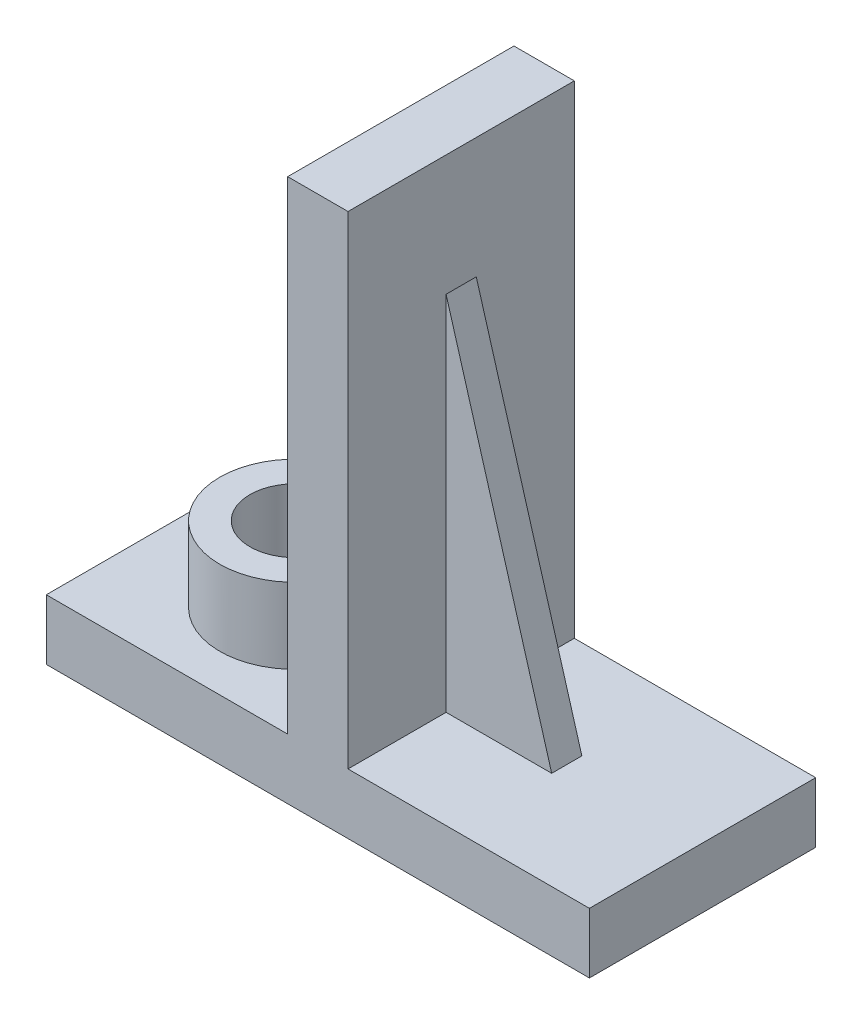
ISO-10303-21;
HEADER;
FILE_DESCRIPTION(('STEP AP214'),'2;1');
FILE_NAME('part.step','',(''),(''),'','','');
FILE_SCHEMA(('AUTOMOTIVE_DESIGN { 1 0 10303 214 1 1 1 1 }'));
ENDSEC;
DATA;
#1=APPLICATION_CONTEXT('core data for automotive mechanical design processes');
#2=APPLICATION_PROTOCOL_DEFINITION('international standard','automotive_design',2000,#1);
#3=PRODUCT_CONTEXT('',#1,'mechanical');
#4=PRODUCT('Part','Part','',(#3));
#5=PRODUCT_RELATED_PRODUCT_CATEGORY('part','',(#4));
#6=PRODUCT_DEFINITION_FORMATION('','',#4);
#7=PRODUCT_DEFINITION_CONTEXT('part definition',#1,'design');
#8=PRODUCT_DEFINITION('design','',#6,#7);
#9=PRODUCT_DEFINITION_SHAPE('','',#8);
#10=(LENGTH_UNIT() NAMED_UNIT(*) SI_UNIT(.MILLI.,.METRE.));
#11=(NAMED_UNIT(*) PLANE_ANGLE_UNIT() SI_UNIT($,.RADIAN.));
#12=(NAMED_UNIT(*) SI_UNIT($,.STERADIAN.) SOLID_ANGLE_UNIT());
#13=UNCERTAINTY_MEASURE_WITH_UNIT(LENGTH_MEASURE(1.E-05),#10,'distance_accuracy_value','');
#14=(GEOMETRIC_REPRESENTATION_CONTEXT(3) GLOBAL_UNCERTAINTY_ASSIGNED_CONTEXT((#13)) GLOBAL_UNIT_ASSIGNED_CONTEXT((#10,
#11,#12)) REPRESENTATION_CONTEXT('',''));
#15=CARTESIAN_POINT('',(0.,0.,0.));
#16=DIRECTION('',(0.,0.,1.));
#17=DIRECTION('',(1.,0.,0.));
#18=AXIS2_PLACEMENT_3D('',#15,#16,#17);
#19=CARTESIAN_POINT('',(0.,0.,15.));
#20=DIRECTION('',(1.,0.,0.));
#21=DIRECTION('',(0.,0.,-1.));
#22=AXIS2_PLACEMENT_3D('',#19,#20,#21);
#23=PLANE('',#22);
#24=DIRECTION('',(0.,-1.,0.));
#25=VECTOR('',#24,1.);
#26=CARTESIAN_POINT('',(0.,0.,15.));
#27=LINE('',#26,#25);
#28=CARTESIAN_POINT('',(0.,8.,15.));
#29=VERTEX_POINT('',#28);
#30=CARTESIAN_POINT('',(0.,0.,15.));
#31=VERTEX_POINT('',#30);
#32=EDGE_CURVE('E191',#29,#31,#27,.T.);
#33=ORIENTED_EDGE('',*,*,#32,.F.);
#34=DIRECTION('',(0.,0.,1.));
#35=VECTOR('',#34,1.);
#36=CARTESIAN_POINT('',(0.,8.,-15.));
#37=LINE('',#36,#35);
#38=CARTESIAN_POINT('',(0.,8.,-15.));
#39=VERTEX_POINT('',#38);
#40=EDGE_CURVE('E177',#39,#29,#37,.T.);
#41=ORIENTED_EDGE('',*,*,#40,.F.);
#42=DIRECTION('',(0.,-1.,0.));
#43=VECTOR('',#42,1.);
#44=CARTESIAN_POINT('',(0.,0.,-15.));
#45=LINE('',#44,#43);
#46=CARTESIAN_POINT('',(0.,0.,-15.));
#47=VERTEX_POINT('',#46);
#48=EDGE_CURVE('E173',#39,#47,#45,.T.);
#49=ORIENTED_EDGE('',*,*,#48,.T.);
#50=DIRECTION('',(0.,0.,-1.));
#51=VECTOR('',#50,1.);
#52=CARTESIAN_POINT('',(0.,0.,15.));
#53=LINE('',#52,#51);
#54=EDGE_CURVE('E44',#31,#47,#53,.T.);
#55=ORIENTED_EDGE('',*,*,#54,.F.);
#56=EDGE_LOOP('',(#33,#41,#49,#55));
#57=FACE_BOUND('',#56,.T.);
#58=ADVANCED_FACE('F37',(#57),#23,.F.);
#59=CARTESIAN_POINT('',(0.,0.,15.));
#60=DIRECTION('',(0.,1.,0.));
#61=DIRECTION('',(0.,0.,1.));
#62=AXIS2_PLACEMENT_3D('',#59,#60,#61);
#63=PLANE('',#62);
#64=ORIENTED_EDGE('',*,*,#54,.T.);
#65=DIRECTION('',(1.,0.,0.));
#66=VECTOR('',#65,1.);
#67=CARTESIAN_POINT('',(0.,0.,-15.));
#68=LINE('',#67,#66);
#69=CARTESIAN_POINT('',(72.,0.,-15.));
#70=VERTEX_POINT('',#69);
#71=EDGE_CURVE('E205',#47,#70,#68,.T.);
#72=ORIENTED_EDGE('',*,*,#71,.T.);
#73=DIRECTION('',(0.,0.,-1.));
#74=VECTOR('',#73,1.);
#75=CARTESIAN_POINT('',(72.,0.,15.));
#76=LINE('',#75,#74);
#77=CARTESIAN_POINT('',(72.,0.,15.));
#78=VERTEX_POINT('',#77);
#79=EDGE_CURVE('E202',#78,#70,#76,.T.);
#80=ORIENTED_EDGE('',*,*,#79,.F.);
#81=DIRECTION('',(1.,0.,0.));
#82=VECTOR('',#81,1.);
#83=CARTESIAN_POINT('',(0.,0.,15.));
#84=LINE('',#83,#82);
#85=EDGE_CURVE('E193',#31,#78,#84,.T.);
#86=ORIENTED_EDGE('',*,*,#85,.F.);
#87=EDGE_LOOP('',(#64,#72,#80,#86));
#88=FACE_BOUND('',#87,.T.);
#89=ADVANCED_FACE('F216',(#88),#63,.F.);
#90=CARTESIAN_POINT('',(72.,0.,15.));
#91=DIRECTION('',(-1.,0.,0.));
#92=DIRECTION('',(0.,0.,1.));
#93=AXIS2_PLACEMENT_3D('',#90,#91,#92);
#94=PLANE('',#93);
#95=ORIENTED_EDGE('',*,*,#79,.T.);
#96=DIRECTION('',(0.,1.,0.));
#97=VECTOR('',#96,1.);
#98=CARTESIAN_POINT('',(72.,0.,-15.));
#99=LINE('',#98,#97);
#100=CARTESIAN_POINT('',(72.,8.00000000000001,-15.));
#101=VERTEX_POINT('',#100);
#102=EDGE_CURVE('E208',#70,#101,#99,.T.);
#103=ORIENTED_EDGE('',*,*,#102,.T.);
#104=DIRECTION('',(0.,0.,1.));
#105=VECTOR('',#104,1.);
#106=CARTESIAN_POINT('',(72.,8.00000000000001,-15.));
#107=LINE('',#106,#105);
#108=CARTESIAN_POINT('',(72.,8.00000000000001,15.));
#109=VERTEX_POINT('',#108);
#110=EDGE_CURVE('E174',#101,#109,#107,.T.);
#111=ORIENTED_EDGE('',*,*,#110,.T.);
#112=DIRECTION('',(0.,1.,0.));
#113=VECTOR('',#112,1.);
#114=CARTESIAN_POINT('',(72.,0.,15.));
#115=LINE('',#114,#113);
#116=EDGE_CURVE('E196',#78,#109,#115,.T.);
#117=ORIENTED_EDGE('',*,*,#116,.F.);
#118=EDGE_LOOP('',(#95,#103,#111,#117));
#119=FACE_BOUND('',#118,.T.);
#120=ADVANCED_FACE('F227',(#119),#94,.F.);
#121=CARTESIAN_POINT('',(0.,72.,15.));
#122=DIRECTION('',(0.,-1.,0.));
#123=DIRECTION('',(0.,0.,-1.));
#124=AXIS2_PLACEMENT_3D('',#121,#122,#123);
#125=PLANE('',#124);
#126=DIRECTION('',(-1.,0.,0.));
#127=VECTOR('',#126,1.);
#128=CARTESIAN_POINT('',(0.,72.,15.));
#129=LINE('',#128,#127);
#130=CARTESIAN_POINT('',(40.,72.,15.));
#131=VERTEX_POINT('',#130);
#132=CARTESIAN_POINT('',(32.,72.,15.));
#133=VERTEX_POINT('',#132);
#134=EDGE_CURVE('E199',#131,#133,#129,.T.);
#135=ORIENTED_EDGE('',*,*,#134,.F.);
#136=DIRECTION('',(0.,0.,1.));
#137=VECTOR('',#136,1.);
#138=CARTESIAN_POINT('',(40.,72.,-15.));
#139=LINE('',#138,#137);
#140=CARTESIAN_POINT('',(40.,72.,-15.));
#141=VERTEX_POINT('',#140);
#142=EDGE_CURVE('E171',#141,#131,#139,.T.);
#143=ORIENTED_EDGE('',*,*,#142,.F.);
#144=DIRECTION('',(-1.,0.,0.));
#145=VECTOR('',#144,1.);
#146=CARTESIAN_POINT('',(0.,72.,-15.));
#147=LINE('',#146,#145);
#148=CARTESIAN_POINT('',(32.,72.,-15.));
#149=VERTEX_POINT('',#148);
#150=EDGE_CURVE('E194',#141,#149,#147,.T.);
#151=ORIENTED_EDGE('',*,*,#150,.T.);
#152=DIRECTION('',(0.,0.,1.));
#153=VECTOR('',#152,1.);
#154=CARTESIAN_POINT('',(32.,72.,-15.));
#155=LINE('',#154,#153);
#156=EDGE_CURVE('E157',#149,#133,#155,.T.);
#157=ORIENTED_EDGE('',*,*,#156,.T.);
#158=EDGE_LOOP('',(#135,#143,#151,#157));
#159=FACE_BOUND('',#158,.T.);
#160=ADVANCED_FACE('F241',(#159),#125,.F.);
#161=CARTESIAN_POINT('',(0.,0.,15.));
#162=DIRECTION('',(0.,0.,-1.));
#163=DIRECTION('',(-1.,0.,0.));
#164=AXIS2_PLACEMENT_3D('',#161,#162,#163);
#165=PLANE('',#164);
#166=DIRECTION('',(1.,0.,0.));
#167=VECTOR('',#166,1.);
#168=CARTESIAN_POINT('',(72.,8.00000000000001,15.));
#169=LINE('',#168,#167);
#170=CARTESIAN_POINT('',(40.,8.,15.));
#171=VERTEX_POINT('',#170);
#172=EDGE_CURVE('E162',#171,#109,#169,.T.);
#173=ORIENTED_EDGE('',*,*,#172,.F.);
#174=DIRECTION('',(0.,-1.,0.));
#175=VECTOR('',#174,1.);
#176=CARTESIAN_POINT('',(40.,8.,15.));
#177=LINE('',#176,#175);
#178=EDGE_CURVE('E166',#131,#171,#177,.T.);
#179=ORIENTED_EDGE('',*,*,#178,.F.);
#180=ORIENTED_EDGE('',*,*,#134,.T.);
#181=DIRECTION('',(0.,1.,0.));
#182=VECTOR('',#181,1.);
#183=CARTESIAN_POINT('',(32.,72.,15.));
#184=LINE('',#183,#182);
#185=CARTESIAN_POINT('',(32.,8.,15.));
#186=VERTEX_POINT('',#185);
#187=EDGE_CURVE('E182',#186,#133,#184,.T.);
#188=ORIENTED_EDGE('',*,*,#187,.F.);
#189=DIRECTION('',(1.,0.,0.));
#190=VECTOR('',#189,1.);
#191=CARTESIAN_POINT('',(32.,8.,15.));
#192=LINE('',#191,#190);
#193=EDGE_CURVE('E169',#29,#186,#192,.T.);
#194=ORIENTED_EDGE('',*,*,#193,.F.);
#195=ORIENTED_EDGE('',*,*,#32,.T.);
#196=ORIENTED_EDGE('',*,*,#85,.T.);
#197=ORIENTED_EDGE('',*,*,#116,.T.);
#198=EDGE_LOOP('',(#173,#179,#180,#188,#194,#195,#196,#197));
#199=FACE_BOUND('',#198,.T.);
#200=ADVANCED_FACE('F231',(#199),#165,.F.);
#201=CARTESIAN_POINT('',(0.,0.,-15.));
#202=DIRECTION('',(0.,0.,-1.));
#203=DIRECTION('',(-1.,0.,0.));
#204=AXIS2_PLACEMENT_3D('',#201,#202,#203);
#205=PLANE('',#204);
#206=DIRECTION('',(0.,-1.,0.));
#207=VECTOR('',#206,1.);
#208=CARTESIAN_POINT('',(40.,8.,-15.));
#209=LINE('',#208,#207);
#210=CARTESIAN_POINT('',(40.,8.,-15.));
#211=VERTEX_POINT('',#210);
#212=EDGE_CURVE('E158',#141,#211,#209,.T.);
#213=ORIENTED_EDGE('',*,*,#212,.T.);
#214=DIRECTION('',(1.,0.,0.));
#215=VECTOR('',#214,1.);
#216=CARTESIAN_POINT('',(72.,8.00000000000001,-15.));
#217=LINE('',#216,#215);
#218=EDGE_CURVE('E161',#211,#101,#217,.T.);
#219=ORIENTED_EDGE('',*,*,#218,.T.);
#220=ORIENTED_EDGE('',*,*,#102,.F.);
#221=ORIENTED_EDGE('',*,*,#71,.F.);
#222=ORIENTED_EDGE('',*,*,#48,.F.);
#223=DIRECTION('',(1.,0.,0.));
#224=VECTOR('',#223,1.);
#225=CARTESIAN_POINT('',(32.,8.,-15.));
#226=LINE('',#225,#224);
#227=CARTESIAN_POINT('',(32.,8.,-15.));
#228=VERTEX_POINT('',#227);
#229=EDGE_CURVE('E185',#39,#228,#226,.T.);
#230=ORIENTED_EDGE('',*,*,#229,.T.);
#231=DIRECTION('',(0.,1.,0.));
#232=VECTOR('',#231,1.);
#233=CARTESIAN_POINT('',(32.,72.,-15.));
#234=LINE('',#233,#232);
#235=EDGE_CURVE('E59',#228,#149,#234,.T.);
#236=ORIENTED_EDGE('',*,*,#235,.T.);
#237=ORIENTED_EDGE('',*,*,#150,.F.);
#238=EDGE_LOOP('',(#213,#219,#220,#221,#222,#230,#236,#237));
#239=FACE_BOUND('',#238,.T.);
#240=ADVANCED_FACE('F225',(#239),#205,.T.);
#241=CARTESIAN_POINT('',(32.,72.,-15.));
#242=DIRECTION('',(1.,0.,0.));
#243=DIRECTION('',(0.,1.,0.));
#244=AXIS2_PLACEMENT_3D('',#241,#242,#243);
#245=PLANE('',#244);
#246=ORIENTED_EDGE('',*,*,#187,.T.);
#247=ORIENTED_EDGE('',*,*,#156,.F.);
#248=ORIENTED_EDGE('',*,*,#235,.F.);
#249=DIRECTION('',(0.,0.,1.));
#250=VECTOR('',#249,1.);
#251=CARTESIAN_POINT('',(32.,8.,-15.));
#252=LINE('',#251,#250);
#253=EDGE_CURVE('E179',#228,#186,#252,.T.);
#254=ORIENTED_EDGE('',*,*,#253,.T.);
#255=EDGE_LOOP('',(#246,#247,#248,#254));
#256=FACE_BOUND('',#255,.T.);
#257=ADVANCED_FACE('F270',(#256),#245,.F.);
#258=CARTESIAN_POINT('',(32.,8.,-15.));
#259=DIRECTION('',(0.,-1.,0.));
#260=DIRECTION('',(1.,0.,0.));
#261=AXIS2_PLACEMENT_3D('',#258,#259,#260);
#262=PLANE('',#261);
#263=CARTESIAN_POINT('',(18.,8.,0.));
#264=DIRECTION('',(0.,-1.,0.));
#265=DIRECTION('',(1.,0.,0.));
#266=AXIS2_PLACEMENT_3D('',#263,#264,#265);
#267=CIRCLE('',#266,9.99999999999999);
#268=CARTESIAN_POINT('',(28.,8.,0.));
#269=VERTEX_POINT('',#268);
#270=EDGE_CURVE('E11',#269,#269,#267,.F.);
#271=ORIENTED_EDGE('',*,*,#270,.F.);
#272=EDGE_LOOP('',(#271));
#273=FACE_BOUND('',#272,.T.);
#274=ORIENTED_EDGE('',*,*,#193,.T.);
#275=ORIENTED_EDGE('',*,*,#253,.F.);
#276=ORIENTED_EDGE('',*,*,#229,.F.);
#277=ORIENTED_EDGE('',*,*,#40,.T.);
#278=EDGE_LOOP('',(#274,#275,#276,#277));
#279=FACE_BOUND('',#278,.T.);
#280=ADVANCED_FACE('F236',(#273,#279),#262,.F.);
#281=CARTESIAN_POINT('',(40.,8.,-15.));
#282=DIRECTION('',(-1.,0.,0.));
#283=DIRECTION('',(0.,0.,1.));
#284=AXIS2_PLACEMENT_3D('',#281,#282,#283);
#285=PLANE('',#284);
#286=DIRECTION('',(0.,0.,1.));
#287=VECTOR('',#286,1.);
#288=CARTESIAN_POINT('',(40.,8.,-15.));
#289=LINE('',#288,#287);
#290=CARTESIAN_POINT('',(40.,8.,2.));
#291=VERTEX_POINT('',#290);
#292=EDGE_CURVE('E165',#291,#171,#289,.T.);
#293=ORIENTED_EDGE('',*,*,#292,.F.);
#294=DIRECTION('',(0.,1.,0.));
#295=VECTOR('',#294,1.);
#296=CARTESIAN_POINT('',(40.,8.,2.));
#297=LINE('',#296,#295);
#298=CARTESIAN_POINT('',(40.,56.,2.));
#299=VERTEX_POINT('',#298);
#300=EDGE_CURVE('E51',#291,#299,#297,.T.);
#301=ORIENTED_EDGE('',*,*,#300,.T.);
#302=DIRECTION('',(0.,0.,1.));
#303=VECTOR('',#302,1.);
#304=CARTESIAN_POINT('',(40.,56.,-2.));
#305=LINE('',#304,#303);
#306=CARTESIAN_POINT('',(40.,56.,-2.));
#307=VERTEX_POINT('',#306);
#308=EDGE_CURVE('E129',#307,#299,#305,.T.);
#309=ORIENTED_EDGE('',*,*,#308,.F.);
#310=DIRECTION('',(0.,1.,0.));
#311=VECTOR('',#310,1.);
#312=CARTESIAN_POINT('',(40.,8.,-2.));
#313=LINE('',#312,#311);
#314=CARTESIAN_POINT('',(40.,8.,-2.));
#315=VERTEX_POINT('',#314);
#316=EDGE_CURVE('E135',#315,#307,#313,.T.);
#317=ORIENTED_EDGE('',*,*,#316,.F.);
#318=EDGE_CURVE('E141',#211,#315,#289,.T.);
#319=ORIENTED_EDGE('',*,*,#318,.F.);
#320=ORIENTED_EDGE('',*,*,#212,.F.);
#321=ORIENTED_EDGE('',*,*,#142,.T.);
#322=ORIENTED_EDGE('',*,*,#178,.T.);
#323=EDGE_LOOP('',(#293,#301,#309,#317,#319,#320,#321,#322));
#324=FACE_BOUND('',#323,.T.);
#325=ADVANCED_FACE('F244',(#324),#285,.F.);
#326=CARTESIAN_POINT('',(72.,8.00000000000001,-15.));
#327=DIRECTION('',(0.,-1.,0.));
#328=DIRECTION('',(1.,0.,0.));
#329=AXIS2_PLACEMENT_3D('',#326,#327,#328);
#330=PLANE('',#329);
#331=ORIENTED_EDGE('',*,*,#172,.T.);
#332=ORIENTED_EDGE('',*,*,#110,.F.);
#333=ORIENTED_EDGE('',*,*,#218,.F.);
#334=ORIENTED_EDGE('',*,*,#318,.T.);
#335=DIRECTION('',(-1.,0.,0.));
#336=VECTOR('',#335,1.);
#337=CARTESIAN_POINT('',(72.,8.00000000000001,-2.));
#338=LINE('',#337,#336);
#339=CARTESIAN_POINT('',(54.,8.,-2.));
#340=VERTEX_POINT('',#339);
#341=EDGE_CURVE('E133',#340,#315,#338,.T.);
#342=ORIENTED_EDGE('',*,*,#341,.F.);
#343=DIRECTION('',(0.,0.,1.));
#344=VECTOR('',#343,1.);
#345=CARTESIAN_POINT('',(54.,8.,-2.));
#346=LINE('',#345,#344);
#347=CARTESIAN_POINT('',(54.,8.,2.));
#348=VERTEX_POINT('',#347);
#349=EDGE_CURVE('E121',#340,#348,#346,.T.);
#350=ORIENTED_EDGE('',*,*,#349,.T.);
#351=DIRECTION('',(-1.,0.,0.));
#352=VECTOR('',#351,1.);
#353=CARTESIAN_POINT('',(72.,8.00000000000001,2.));
#354=LINE('',#353,#352);
#355=EDGE_CURVE('E145',#348,#291,#354,.T.);
#356=ORIENTED_EDGE('',*,*,#355,.T.);
#357=ORIENTED_EDGE('',*,*,#292,.T.);
#358=EDGE_LOOP('',(#331,#332,#333,#334,#342,#350,#356,#357));
#359=FACE_BOUND('',#358,.T.);
#360=ADVANCED_FACE('F139',(#359),#330,.F.);
#361=CARTESIAN_POINT('',(18.,18.,0.));
#362=DIRECTION('',(0.,1.,0.));
#363=DIRECTION('',(-1.,0.,0.));
#364=AXIS2_PLACEMENT_3D('',#361,#362,#363);
#365=PLANE('',#364);
#366=CARTESIAN_POINT('',(18.,18.,0.));
#367=DIRECTION('',(0.,1.,0.));
#368=DIRECTION('',(-1.,0.,0.));
#369=AXIS2_PLACEMENT_3D('',#366,#367,#368);
#370=CIRCLE('',#369,9.99999999999999);
#371=CARTESIAN_POINT('',(8.,18.,0.));
#372=VERTEX_POINT('',#371);
#373=EDGE_CURVE('E152',#372,#372,#370,.T.);
#374=ORIENTED_EDGE('',*,*,#373,.T.);
#375=EDGE_LOOP('',(#374));
#376=FACE_BOUND('',#375,.T.);
#377=CARTESIAN_POINT('',(18.,18.,0.));
#378=DIRECTION('',(0.,1.,0.));
#379=DIRECTION('',(-1.,0.,0.));
#380=AXIS2_PLACEMENT_3D('',#377,#378,#379);
#381=CIRCLE('',#380,6.);
#382=CARTESIAN_POINT('',(12.,18.,0.));
#383=VERTEX_POINT('',#382);
#384=EDGE_CURVE('E149',#383,#383,#381,.T.);
#385=ORIENTED_EDGE('',*,*,#384,.F.);
#386=EDGE_LOOP('',(#385));
#387=FACE_BOUND('',#386,.T.);
#388=ADVANCED_FACE('F282',(#376,#387),#365,.T.);
#389=CARTESIAN_POINT('',(18.,18.,0.));
#390=DIRECTION('',(0.,-1.,0.));
#391=DIRECTION('',(1.,0.,0.));
#392=AXIS2_PLACEMENT_3D('',#389,#390,#391);
#393=CYLINDRICAL_SURFACE('',#392,9.99999999999999);
#394=ORIENTED_EDGE('',*,*,#373,.F.);
#395=EDGE_LOOP('',(#394));
#396=FACE_BOUND('',#395,.T.);
#397=ORIENTED_EDGE('',*,*,#270,.T.);
#398=EDGE_LOOP('',(#397));
#399=FACE_BOUND('',#398,.T.);
#400=ADVANCED_FACE('F283',(#396,#399),#393,.T.);
#401=CARTESIAN_POINT('',(18.,18.,0.));
#402=DIRECTION('',(0.,-1.,0.));
#403=DIRECTION('',(1.,0.,0.));
#404=AXIS2_PLACEMENT_3D('',#401,#402,#403);
#405=CYLINDRICAL_SURFACE('',#404,6.);
#406=ORIENTED_EDGE('',*,*,#384,.T.);
#407=EDGE_LOOP('',(#406));
#408=FACE_BOUND('',#407,.T.);
#409=CARTESIAN_POINT('',(18.,8.,0.));
#410=DIRECTION('',(0.,1.,0.));
#411=DIRECTION('',(-1.,0.,0.));
#412=AXIS2_PLACEMENT_3D('',#409,#410,#411);
#413=CIRCLE('',#412,6.);
#414=CARTESIAN_POINT('',(12.,8.,0.));
#415=VERTEX_POINT('',#414);
#416=EDGE_CURVE('E143',#415,#415,#413,.T.);
#417=ORIENTED_EDGE('',*,*,#416,.F.);
#418=EDGE_LOOP('',(#417));
#419=FACE_BOUND('',#418,.T.);
#420=ADVANCED_FACE('F286',(#408,#419),#405,.F.);
#421=ORIENTED_EDGE('',*,*,#416,.T.);
#422=EDGE_LOOP('',(#421));
#423=FACE_BOUND('',#422,.T.);
#424=ADVANCED_FACE('F255',(#423),#262,.F.);
#425=CARTESIAN_POINT('',(0.,0.,-2.));
#426=DIRECTION('',(0.,0.,1.));
#427=DIRECTION('',(1.,0.,0.));
#428=AXIS2_PLACEMENT_3D('',#425,#426,#427);
#429=PLANE('',#428);
#430=ORIENTED_EDGE('',*,*,#341,.T.);
#431=ORIENTED_EDGE('',*,*,#316,.T.);
#432=DIRECTION('',(-0.28,0.96,0.));
#433=VECTOR('',#432,1.);
#434=CARTESIAN_POINT('',(40.,56.,-2.));
#435=LINE('',#434,#433);
#436=EDGE_CURVE('E124',#340,#307,#435,.T.);
#437=ORIENTED_EDGE('',*,*,#436,.F.);
#438=EDGE_LOOP('',(#430,#431,#437));
#439=FACE_BOUND('',#438,.T.);
#440=ADVANCED_FACE('F132',(#439),#429,.F.);
#441=CARTESIAN_POINT('',(0.,0.,2.));
#442=DIRECTION('',(0.,0.,1.));
#443=DIRECTION('',(1.,0.,0.));
#444=AXIS2_PLACEMENT_3D('',#441,#442,#443);
#445=PLANE('',#444);
#446=ORIENTED_EDGE('',*,*,#300,.F.);
#447=ORIENTED_EDGE('',*,*,#355,.F.);
#448=DIRECTION('',(-0.28,0.96,0.));
#449=VECTOR('',#448,1.);
#450=CARTESIAN_POINT('',(40.,56.,2.));
#451=LINE('',#450,#449);
#452=EDGE_CURVE('E126',#348,#299,#451,.T.);
#453=ORIENTED_EDGE('',*,*,#452,.T.);
#454=EDGE_LOOP('',(#446,#447,#453));
#455=FACE_BOUND('',#454,.T.);
#456=ADVANCED_FACE('F247',(#455),#445,.T.);
#457=CARTESIAN_POINT('',(40.,56.,-2.));
#458=DIRECTION('',(0.96,0.28,0.));
#459=DIRECTION('',(-0.28,0.96,0.));
#460=AXIS2_PLACEMENT_3D('',#457,#458,#459);
#461=PLANE('',#460);
#462=ORIENTED_EDGE('',*,*,#452,.F.);
#463=ORIENTED_EDGE('',*,*,#349,.F.);
#464=ORIENTED_EDGE('',*,*,#436,.T.);
#465=ORIENTED_EDGE('',*,*,#308,.T.);
#466=EDGE_LOOP('',(#462,#463,#464,#465));
#467=FACE_BOUND('',#466,.T.);
#468=ADVANCED_FACE('F123',(#467),#461,.T.);
#469=CLOSED_SHELL('',(#58,#89,#120,#160,#200,#240,#257,#280,#325,#360,#388,#400,#420,#424,#440,
#456,#468));
#470=MANIFOLD_SOLID_BREP('B2',#469);
#471=ADVANCED_BREP_SHAPE_REPRESENTATION('',(#18,#470),#14);
#472=SHAPE_DEFINITION_REPRESENTATION(#9,#471);
ENDSEC;
END-ISO-10303-21;
